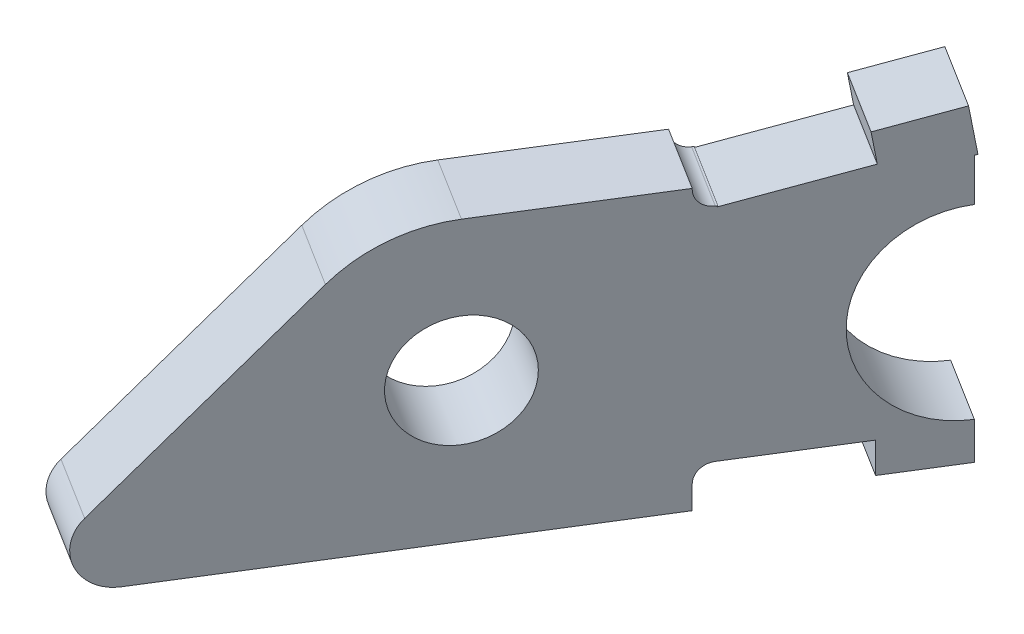
ISO-10303-21;
HEADER;
FILE_DESCRIPTION(('STEP AP214'),'2;1');
FILE_NAME('part.step','',(''),(''),'','','');
FILE_SCHEMA(('AUTOMOTIVE_DESIGN { 1 0 10303 214 1 1 1 1 }'));
ENDSEC;
DATA;
#1=APPLICATION_CONTEXT('core data for automotive mechanical design processes');
#2=APPLICATION_PROTOCOL_DEFINITION('international standard','automotive_design',2000,#1);
#3=PRODUCT_CONTEXT('',#1,'mechanical');
#4=PRODUCT('Part','Part','',(#3));
#5=PRODUCT_RELATED_PRODUCT_CATEGORY('part','',(#4));
#6=PRODUCT_DEFINITION_FORMATION('','',#4);
#7=PRODUCT_DEFINITION_CONTEXT('part definition',#1,'design');
#8=PRODUCT_DEFINITION('design','',#6,#7);
#9=PRODUCT_DEFINITION_SHAPE('','',#8);
#10=(LENGTH_UNIT() NAMED_UNIT(*) SI_UNIT(.MILLI.,.METRE.));
#11=(NAMED_UNIT(*) PLANE_ANGLE_UNIT() SI_UNIT($,.RADIAN.));
#12=(NAMED_UNIT(*) SI_UNIT($,.STERADIAN.) SOLID_ANGLE_UNIT());
#13=UNCERTAINTY_MEASURE_WITH_UNIT(LENGTH_MEASURE(1.E-05),#10,'distance_accuracy_value','');
#14=(GEOMETRIC_REPRESENTATION_CONTEXT(3) GLOBAL_UNCERTAINTY_ASSIGNED_CONTEXT((#13)) GLOBAL_UNIT_ASSIGNED_CONTEXT((#10,
#11,#12)) REPRESENTATION_CONTEXT('',''));
#15=CARTESIAN_POINT('',(0.,0.,0.));
#16=DIRECTION('',(0.,0.,1.));
#17=DIRECTION('',(1.,0.,0.));
#18=AXIS2_PLACEMENT_3D('',#15,#16,#17);
#19=CARTESIAN_POINT('',(-303.516187291777,18.3897329746042,199.478474923757));
#20=DIRECTION('',(0.523412538698552,0.156226295448654,-0.837635158612344));
#21=DIRECTION('',(-0.0827873235380288,0.987721288932455,0.132487412424803));
#22=AXIS2_PLACEMENT_3D('',#19,#20,#21);
#23=PLANE('',#22);
#24=DIRECTION('',(0.84804809615643,0.,0.529919264233198));
#25=VECTOR('',#24,1.);
#26=CARTESIAN_POINT('',(-304.318604910329,27.9632392867643,200.762611545437));
#27=LINE('',#26,#25);
#28=CARTESIAN_POINT('',(-311.102989679581,27.9632392867643,196.523257431571));
#29=VERTEX_POINT('',#28);
#30=CARTESIAN_POINT('',(-304.318604910329,27.9632392867643,200.762611545437));
#31=VERTEX_POINT('',#30);
#32=EDGE_CURVE('E11',#29,#31,#27,.T.);
#33=ORIENTED_EDGE('',*,*,#32,.F.);
#34=DIRECTION('',(-0.0827873235380288,0.987721288932455,0.132487412424803));
#35=VECTOR('',#34,1.);
#36=CARTESIAN_POINT('',(-310.300572061029,18.3897329746042,195.239120809892));
#37=LINE('',#36,#35);
#38=CARTESIAN_POINT('',(-311.109937403664,28.0461313853814,196.53437611432));
#39=VERTEX_POINT('',#38);
#40=EDGE_CURVE('E151',#29,#39,#37,.T.);
#41=ORIENTED_EDGE('',*,*,#40,.T.);
#42=DIRECTION('',(0.84804809615643,0.,0.529919264233198));
#43=VECTOR('',#42,1.);
#44=CARTESIAN_POINT('',(-304.325552634413,28.0461313853814,200.773730228186));
#45=LINE('',#44,#43);
#46=CARTESIAN_POINT('',(-304.325552634413,28.0461313853814,200.773730228186));
#47=VERTEX_POINT('',#46);
#48=EDGE_CURVE('E47',#39,#47,#45,.T.);
#49=ORIENTED_EDGE('',*,*,#48,.T.);
#50=DIRECTION('',(-0.0827873235380288,0.987721288932455,0.132487412424803));
#51=VECTOR('',#50,1.);
#52=CARTESIAN_POINT('',(-303.516187291777,18.3897329746042,199.478474923757));
#53=LINE('',#52,#51);
#54=EDGE_CURVE('E282',#31,#47,#53,.T.);
#55=ORIENTED_EDGE('',*,*,#54,.F.);
#56=EDGE_LOOP('',(#33,#41,#49,#55));
#57=FACE_BOUND('',#56,.T.);
#58=ADVANCED_FACE('F37',(#57),#23,.T.);
#59=CARTESIAN_POINT('',(-315.89166482783,20.7531190864135,219.283378938074));
#60=DIRECTION('',(-0.167940304286642,0.948453350279936,0.26876066776758));
#61=DIRECTION('',(-0.502603701539855,-0.316916775104704,0.804334057998087));
#62=AXIS2_PLACEMENT_3D('',#59,#60,#61);
#63=PLANE('',#62);
#64=ORIENTED_EDGE('',*,*,#48,.F.);
#65=DIRECTION('',(-0.502603701539855,-0.316916775104704,0.804334057998087));
#66=VECTOR('',#65,1.);
#67=CARTESIAN_POINT('',(-322.676049597081,20.7531190864135,215.044024824208));
#68=LINE('',#67,#66);
#69=CARTESIAN_POINT('',(-311.058973651794,28.0782665803526,196.452817062474));
#70=VERTEX_POINT('',#69);
#71=EDGE_CURVE('E215',#70,#39,#68,.T.);
#72=ORIENTED_EDGE('',*,*,#71,.F.);
#73=DIRECTION('',(0.84804809615643,0.,0.529919264233198));
#74=VECTOR('',#73,1.);
#75=CARTESIAN_POINT('',(-304.274588882551,28.0782665803526,200.692171176334));
#76=LINE('',#75,#74);
#77=CARTESIAN_POINT('',(-304.274588882551,28.0782665803526,200.692171176334));
#78=VERTEX_POINT('',#77);
#79=EDGE_CURVE('E275',#70,#78,#76,.T.);
#80=ORIENTED_EDGE('',*,*,#79,.T.);
#81=DIRECTION('',(-0.502603701539855,-0.316916775104704,0.804334057998087));
#82=VECTOR('',#81,1.);
#83=CARTESIAN_POINT('',(-315.89166482783,20.7531190864135,219.283378938074));
#84=LINE('',#83,#82);
#85=EDGE_CURVE('E293',#78,#47,#84,.T.);
#86=ORIENTED_EDGE('',*,*,#85,.T.);
#87=EDGE_LOOP('',(#64,#72,#80,#86));
#88=FACE_BOUND('',#87,.T.);
#89=ADVANCED_FACE('F296',(#88),#63,.F.);
#90=CARTESIAN_POINT('',(-314.872974167204,28.0782665803526,217.653133099463));
#91=DIRECTION('',(0.,1.,0.));
#92=DIRECTION('',(-0.529919264233198,0.,0.84804809615643));
#93=AXIS2_PLACEMENT_3D('',#90,#91,#92);
#94=PLANE('',#93);
#95=ORIENTED_EDGE('',*,*,#79,.F.);
#96=DIRECTION('',(0.529919264233198,0.,-0.84804809615643));
#97=VECTOR('',#96,1.);
#98=CARTESIAN_POINT('',(-321.657358936455,28.0782665803526,213.413778985597));
#99=LINE('',#98,#97);
#100=CARTESIAN_POINT('',(-311.164957504638,28.0782665803526,196.6224266817));
#101=VERTEX_POINT('',#100);
#102=EDGE_CURVE('E212',#70,#101,#99,.F.);
#103=ORIENTED_EDGE('',*,*,#102,.T.);
#104=DIRECTION('',(0.84804809615643,0.,0.529919264233198));
#105=VECTOR('',#104,1.);
#106=CARTESIAN_POINT('',(-304.380572735386,28.0782665803526,200.861780795565));
#107=LINE('',#106,#105);
#108=CARTESIAN_POINT('',(-304.380572735386,28.0782665803526,200.861780795565));
#109=VERTEX_POINT('',#108);
#110=EDGE_CURVE('E272',#101,#109,#107,.T.);
#111=ORIENTED_EDGE('',*,*,#110,.T.);
#112=DIRECTION('',(-0.529919264233198,0.,0.84804809615643));
#113=VECTOR('',#112,1.);
#114=CARTESIAN_POINT('',(-314.872974167204,28.0782665803526,217.653133099463));
#115=LINE('',#114,#113);
#116=EDGE_CURVE('E297',#78,#109,#115,.T.);
#117=ORIENTED_EDGE('',*,*,#116,.F.);
#118=EDGE_LOOP('',(#95,#103,#111,#117));
#119=FACE_BOUND('',#118,.T.);
#120=ADVANCED_FACE('F370',(#119),#94,.T.);
#121=CARTESIAN_POINT('',(-304.380572735386,29.8782665803526,200.861780795565));
#122=DIRECTION('',(0.84804809615643,0.,0.529919264233198));
#123=DIRECTION('',(0.529919264233198,0.,-0.84804809615643));
#124=AXIS2_PLACEMENT_3D('',#121,#122,#123);
#125=CYLINDRICAL_SURFACE('',#124,1.80000000000004);
#126=ORIENTED_EDGE('',*,*,#110,.F.);
#127=CARTESIAN_POINT('',(-311.164957504638,29.8782665803526,196.6224266817));
#128=DIRECTION('',(0.84804809615643,0.,0.529919264233198));
#129=DIRECTION('',(0.529919264233198,0.,-0.84804809615643));
#130=AXIS2_PLACEMENT_3D('',#127,#128,#129);
#131=CIRCLE('',#130,1.80000000000004);
#132=CARTESIAN_POINT('',(-312.118812180258,29.8782665803526,198.148913254781));
#133=VERTEX_POINT('',#132);
#134=EDGE_CURVE('E209',#101,#133,#131,.F.);
#135=ORIENTED_EDGE('',*,*,#134,.T.);
#136=DIRECTION('',(0.84804809615643,0.,0.529919264233198));
#137=VECTOR('',#136,1.);
#138=CARTESIAN_POINT('',(-305.334427411006,29.8782665803526,202.388267368647));
#139=LINE('',#138,#137);
#140=CARTESIAN_POINT('',(-305.334427411006,29.8782665803526,202.388267368647));
#141=VERTEX_POINT('',#140);
#142=EDGE_CURVE('E269',#133,#141,#139,.T.);
#143=ORIENTED_EDGE('',*,*,#142,.T.);
#144=CARTESIAN_POINT('',(-304.380572735386,29.8782665803526,200.861780795565));
#145=DIRECTION('',(0.84804809615643,0.,0.529919264233198));
#146=DIRECTION('',(0.529919264233198,0.,-0.84804809615643));
#147=AXIS2_PLACEMENT_3D('',#144,#145,#146);
#148=CIRCLE('',#147,1.80000000000004);
#149=EDGE_CURVE('E299',#109,#141,#148,.F.);
#150=ORIENTED_EDGE('',*,*,#149,.F.);
#151=EDGE_LOOP('',(#126,#135,#143,#150));
#152=FACE_BOUND('',#151,.T.);
#153=ADVANCED_FACE('F447',(#152),#125,.F.);
#154=CARTESIAN_POINT('',(-305.334427411006,14.9999999999993,202.388267368647));
#155=DIRECTION('',(0.529919264233198,0.,-0.84804809615643));
#156=DIRECTION('',(0.,1.,0.));
#157=AXIS2_PLACEMENT_3D('',#154,#155,#156);
#158=PLANE('',#157);
#159=ORIENTED_EDGE('',*,*,#142,.F.);
#160=DIRECTION('',(0.,1.,0.));
#161=VECTOR('',#160,1.);
#162=CARTESIAN_POINT('',(-312.118812180258,15.,198.148913254781));
#163=LINE('',#162,#161);
#164=CARTESIAN_POINT('',(-312.118812180258,30.,198.148913254781));
#165=VERTEX_POINT('',#164);
#166=EDGE_CURVE('E206',#133,#165,#163,.T.);
#167=ORIENTED_EDGE('',*,*,#166,.T.);
#168=DIRECTION('',(0.84804809615643,0.,0.529919264233198));
#169=VECTOR('',#168,1.);
#170=CARTESIAN_POINT('',(-305.334427411006,30.,202.388267368647));
#171=LINE('',#170,#169);
#172=CARTESIAN_POINT('',(-305.334427411006,30.,202.388267368647));
#173=VERTEX_POINT('',#172);
#174=EDGE_CURVE('E266',#165,#173,#171,.T.);
#175=ORIENTED_EDGE('',*,*,#174,.T.);
#176=DIRECTION('',(0.,1.,0.));
#177=VECTOR('',#176,1.);
#178=CARTESIAN_POINT('',(-305.334427411006,14.9999999999993,202.388267368647));
#179=LINE('',#178,#177);
#180=EDGE_CURVE('E305',#141,#173,#179,.T.);
#181=ORIENTED_EDGE('',*,*,#180,.F.);
#182=EDGE_LOOP('',(#159,#167,#175,#181));
#183=FACE_BOUND('',#182,.T.);
#184=ADVANCED_FACE('F443',(#183),#158,.T.);
#185=CARTESIAN_POINT('',(-314.872974167204,30.,217.653133099463));
#186=DIRECTION('',(0.,1.,0.));
#187=DIRECTION('',(-0.529919264233199,0.,0.84804809615643));
#188=AXIS2_PLACEMENT_3D('',#185,#186,#187);
#189=PLANE('',#188);
#190=ORIENTED_EDGE('',*,*,#174,.F.);
#191=DIRECTION('',(0.529919264233198,0.,-0.84804809615643));
#192=VECTOR('',#191,1.);
#193=CARTESIAN_POINT('',(-321.657358936455,30.,213.413778985597));
#194=LINE('',#193,#192);
#195=CARTESIAN_POINT('',(-321.657358936455,30.,213.413778985597));
#196=VERTEX_POINT('',#195);
#197=EDGE_CURVE('E203',#165,#196,#194,.F.);
#198=ORIENTED_EDGE('',*,*,#197,.T.);
#199=DIRECTION('',(0.84804809615643,0.,0.529919264233198));
#200=VECTOR('',#199,1.);
#201=CARTESIAN_POINT('',(-314.872974167204,30.,217.653133099463));
#202=LINE('',#201,#200);
#203=CARTESIAN_POINT('',(-314.872974167204,30.,217.653133099463));
#204=VERTEX_POINT('',#203);
#205=EDGE_CURVE('E263',#196,#204,#202,.T.);
#206=ORIENTED_EDGE('',*,*,#205,.T.);
#207=DIRECTION('',(-0.529919264233199,0.,0.84804809615643));
#208=VECTOR('',#207,1.);
#209=CARTESIAN_POINT('',(-314.872974167204,30.,217.653133099463));
#210=LINE('',#209,#208);
#211=EDGE_CURVE('E308',#173,#204,#210,.T.);
#212=ORIENTED_EDGE('',*,*,#211,.F.);
#213=EDGE_LOOP('',(#190,#198,#206,#212));
#214=FACE_BOUND('',#213,.T.);
#215=ADVANCED_FACE('F439',(#214),#189,.T.);
#216=CARTESIAN_POINT('',(-314.872974167204,15.,217.653133099463));
#217=DIRECTION('',(0.84804809615643,0.,0.529919264233198));
#218=DIRECTION('',(0.529919264233198,0.,-0.84804809615643));
#219=AXIS2_PLACEMENT_3D('',#216,#217,#218);
#220=CYLINDRICAL_SURFACE('',#219,15.);
#221=ORIENTED_EDGE('',*,*,#205,.F.);
#222=CARTESIAN_POINT('',(-321.657358936455,15.,213.413778985597));
#223=DIRECTION('',(0.84804809615643,0.,0.529919264233198));
#224=DIRECTION('',(0.529919264233198,0.,-0.84804809615643));
#225=AXIS2_PLACEMENT_3D('',#222,#223,#224);
#226=CIRCLE('',#225,15.);
#227=CARTESIAN_POINT('',(-327.278001514765,25.6066017177983,222.408687379065));
#228=VERTEX_POINT('',#227);
#229=EDGE_CURVE('E200',#196,#228,#226,.T.);
#230=ORIENTED_EDGE('',*,*,#229,.T.);
#231=DIRECTION('',(0.84804809615643,0.,0.529919264233198));
#232=VECTOR('',#231,1.);
#233=CARTESIAN_POINT('',(-320.493616745514,25.6066017177983,226.648041492931));
#234=LINE('',#233,#232);
#235=CARTESIAN_POINT('',(-320.493616745514,25.6066017177983,226.648041492931));
#236=VERTEX_POINT('',#235);
#237=EDGE_CURVE('E260',#228,#236,#234,.T.);
#238=ORIENTED_EDGE('',*,*,#237,.T.);
#239=CARTESIAN_POINT('',(-314.872974167204,15.,217.653133099463));
#240=DIRECTION('',(0.84804809615643,0.,0.529919264233198));
#241=DIRECTION('',(0.529919264233198,0.,-0.84804809615643));
#242=AXIS2_PLACEMENT_3D('',#239,#240,#241);
#243=CIRCLE('',#242,15.);
#244=EDGE_CURVE('E311',#204,#236,#243,.T.);
#245=ORIENTED_EDGE('',*,*,#244,.F.);
#246=EDGE_LOOP('',(#221,#230,#238,#245));
#247=FACE_BOUND('',#246,.T.);
#248=ADVANCED_FACE('F435',(#247),#220,.T.);
#249=CARTESIAN_POINT('',(-320.493616745514,25.6066017177983,226.648041492931));
#250=DIRECTION('',(-0.374709505220678,0.707106781186551,0.59966055956455));
#251=DIRECTION('',(-0.374709505220682,-0.707106781186544,0.599660559564557));
#252=AXIS2_PLACEMENT_3D('',#249,#250,#251);
#253=PLANE('',#252);
#254=ORIENTED_EDGE('',*,*,#237,.F.);
#255=DIRECTION('',(-0.374709505220682,-0.707106781186544,0.599660559564557));
#256=VECTOR('',#255,1.);
#257=CARTESIAN_POINT('',(-327.278001514765,25.6066017177983,222.408687379065));
#258=LINE('',#257,#256);
#259=CARTESIAN_POINT('',(-337.228917978758,6.8284271247462,238.333482591996));
#260=VERTEX_POINT('',#259);
#261=EDGE_CURVE('E197',#228,#260,#258,.T.);
#262=ORIENTED_EDGE('',*,*,#261,.T.);
#263=DIRECTION('',(0.84804809615643,0.,0.529919264233198));
#264=VECTOR('',#263,1.);
#265=CARTESIAN_POINT('',(-330.444533209507,6.82842712474621,242.572836705862));
#266=LINE('',#265,#264);
#267=CARTESIAN_POINT('',(-330.444533209507,6.82842712474621,242.572836705862));
#268=VERTEX_POINT('',#267);
#269=EDGE_CURVE('E257',#260,#268,#266,.T.);
#270=ORIENTED_EDGE('',*,*,#269,.T.);
#271=DIRECTION('',(-0.374709505220682,-0.707106781186544,0.599660559564557));
#272=VECTOR('',#271,1.);
#273=CARTESIAN_POINT('',(-320.493616745514,25.6066017177983,226.648041492931));
#274=LINE('',#273,#272);
#275=EDGE_CURVE('E314',#236,#268,#274,.T.);
#276=ORIENTED_EDGE('',*,*,#275,.F.);
#277=EDGE_LOOP('',(#254,#262,#270,#276));
#278=FACE_BOUND('',#277,.T.);
#279=ADVANCED_FACE('F431',(#278),#253,.T.);
#280=CARTESIAN_POINT('',(-328.945695188624,4.,240.174194467604));
#281=DIRECTION('',(0.84804809615643,0.,0.529919264233198));
#282=DIRECTION('',(0.529919264233198,0.,-0.84804809615643));
#283=AXIS2_PLACEMENT_3D('',#280,#281,#282);
#284=CYLINDRICAL_SURFACE('',#283,4.);
#285=ORIENTED_EDGE('',*,*,#269,.F.);
#286=CARTESIAN_POINT('',(-335.730079957875,4.,235.934840353738));
#287=DIRECTION('',(0.84804809615643,0.,0.529919264233198));
#288=DIRECTION('',(0.529919264233198,0.,-0.84804809615643));
#289=AXIS2_PLACEMENT_3D('',#286,#287,#288);
#290=CIRCLE('',#289,4.);
#291=CARTESIAN_POINT('',(-335.730079957875,0.,235.934840353738));
#292=VERTEX_POINT('',#291);
#293=EDGE_CURVE('E194',#260,#292,#290,.T.);
#294=ORIENTED_EDGE('',*,*,#293,.T.);
#295=DIRECTION('',(0.84804809615643,0.,0.529919264233198));
#296=VECTOR('',#295,1.);
#297=CARTESIAN_POINT('',(-328.945695188624,0.,240.174194467604));
#298=LINE('',#297,#296);
#299=CARTESIAN_POINT('',(-328.945695188624,0.,240.174194467604));
#300=VERTEX_POINT('',#299);
#301=EDGE_CURVE('E254',#292,#300,#298,.T.);
#302=ORIENTED_EDGE('',*,*,#301,.T.);
#303=CARTESIAN_POINT('',(-328.945695188624,4.,240.174194467604));
#304=DIRECTION('',(0.84804809615643,0.,0.529919264233198));
#305=DIRECTION('',(0.529919264233198,0.,-0.84804809615643));
#306=AXIS2_PLACEMENT_3D('',#303,#304,#305);
#307=CIRCLE('',#306,4.);
#308=EDGE_CURVE('E317',#268,#300,#307,.T.);
#309=ORIENTED_EDGE('',*,*,#308,.F.);
#310=EDGE_LOOP('',(#285,#294,#302,#309));
#311=FACE_BOUND('',#310,.T.);
#312=ADVANCED_FACE('F427',(#311),#284,.T.);
#313=CARTESIAN_POINT('',(-314.872974167204,0.,217.653133099463));
#314=DIRECTION('',(0.,-1.,0.));
#315=DIRECTION('',(0.529919264233199,0.,-0.84804809615643));
#316=AXIS2_PLACEMENT_3D('',#313,#314,#315);
#317=PLANE('',#316);
#318=ORIENTED_EDGE('',*,*,#301,.F.);
#319=DIRECTION('',(0.529919264233198,0.,-0.84804809615643));
#320=VECTOR('',#319,1.);
#321=CARTESIAN_POINT('',(-321.657358936455,0.,213.413778985597));
#322=LINE('',#321,#320);
#323=CARTESIAN_POINT('',(-312.118812180258,0.,198.148913254781));
#324=VERTEX_POINT('',#323);
#325=EDGE_CURVE('E191',#292,#324,#322,.T.);
#326=ORIENTED_EDGE('',*,*,#325,.T.);
#327=DIRECTION('',(0.84804809615643,0.,0.529919264233198));
#328=VECTOR('',#327,1.);
#329=CARTESIAN_POINT('',(-305.334427411006,0.,202.388267368647));
#330=LINE('',#329,#328);
#331=CARTESIAN_POINT('',(-305.334427411006,0.,202.388267368647));
#332=VERTEX_POINT('',#331);
#333=EDGE_CURVE('E251',#324,#332,#330,.T.);
#334=ORIENTED_EDGE('',*,*,#333,.T.);
#335=DIRECTION('',(0.529919264233199,0.,-0.84804809615643));
#336=VECTOR('',#335,1.);
#337=CARTESIAN_POINT('',(-314.872974167204,0.,217.653133099463));
#338=LINE('',#337,#336);
#339=EDGE_CURVE('E320',#300,#332,#338,.T.);
#340=ORIENTED_EDGE('',*,*,#339,.F.);
#341=EDGE_LOOP('',(#318,#326,#334,#340));
#342=FACE_BOUND('',#341,.T.);
#343=ADVANCED_FACE('F423',(#342),#317,.T.);
#344=CARTESIAN_POINT('',(-305.334427411006,15.,202.388267368647));
#345=DIRECTION('',(0.529919264233198,0.,-0.84804809615643));
#346=DIRECTION('',(0.,1.,0.));
#347=AXIS2_PLACEMENT_3D('',#344,#345,#346);
#348=PLANE('',#347);
#349=ORIENTED_EDGE('',*,*,#333,.F.);
#350=DIRECTION('',(0.,1.,0.));
#351=VECTOR('',#350,1.);
#352=CARTESIAN_POINT('',(-312.118812180258,15.,198.148913254781));
#353=LINE('',#352,#351);
#354=CARTESIAN_POINT('',(-312.118812180258,2.5,198.148913254781));
#355=VERTEX_POINT('',#354);
#356=EDGE_CURVE('E188',#324,#355,#353,.T.);
#357=ORIENTED_EDGE('',*,*,#356,.T.);
#358=DIRECTION('',(0.84804809615643,0.,0.529919264233198));
#359=VECTOR('',#358,1.);
#360=CARTESIAN_POINT('',(-305.334427411006,2.50000000000001,202.388267368647));
#361=LINE('',#360,#359);
#362=CARTESIAN_POINT('',(-305.334427411006,2.50000000000001,202.388267368647));
#363=VERTEX_POINT('',#362);
#364=EDGE_CURVE('E248',#355,#363,#361,.T.);
#365=ORIENTED_EDGE('',*,*,#364,.T.);
#366=DIRECTION('',(0.,1.,0.));
#367=VECTOR('',#366,1.);
#368=CARTESIAN_POINT('',(-305.334427411006,15.,202.388267368647));
#369=LINE('',#368,#367);
#370=EDGE_CURVE('E323',#332,#363,#369,.T.);
#371=ORIENTED_EDGE('',*,*,#370,.F.);
#372=EDGE_LOOP('',(#349,#357,#365,#371));
#373=FACE_BOUND('',#372,.T.);
#374=ADVANCED_FACE('F419',(#373),#348,.T.);
#375=CARTESIAN_POINT('',(-304.380572735386,2.50000000000001,200.861780795565));
#376=DIRECTION('',(0.84804809615643,0.,0.529919264233198));
#377=DIRECTION('',(0.529919264233198,0.,-0.84804809615643));
#378=AXIS2_PLACEMENT_3D('',#375,#376,#377);
#379=CYLINDRICAL_SURFACE('',#378,1.79999999999999);
#380=ORIENTED_EDGE('',*,*,#364,.F.);
#381=CARTESIAN_POINT('',(-311.164957504638,2.50000000000001,196.6224266817));
#382=DIRECTION('',(0.84804809615643,0.,0.529919264233198));
#383=DIRECTION('',(0.529919264233198,0.,-0.84804809615643));
#384=AXIS2_PLACEMENT_3D('',#381,#382,#383);
#385=CIRCLE('',#384,1.79999999999999);
#386=CARTESIAN_POINT('',(-311.164957504638,4.3,196.6224266817));
#387=VERTEX_POINT('',#386);
#388=EDGE_CURVE('E185',#355,#387,#385,.F.);
#389=ORIENTED_EDGE('',*,*,#388,.T.);
#390=DIRECTION('',(0.84804809615643,0.,0.529919264233198));
#391=VECTOR('',#390,1.);
#392=CARTESIAN_POINT('',(-304.380572735386,4.30000000000001,200.861780795565));
#393=LINE('',#392,#391);
#394=CARTESIAN_POINT('',(-304.380572735386,4.30000000000001,200.861780795565));
#395=VERTEX_POINT('',#394);
#396=EDGE_CURVE('E245',#387,#395,#393,.T.);
#397=ORIENTED_EDGE('',*,*,#396,.T.);
#398=CARTESIAN_POINT('',(-304.380572735386,2.50000000000001,200.861780795565));
#399=DIRECTION('',(0.84804809615643,0.,0.529919264233198));
#400=DIRECTION('',(0.529919264233198,0.,-0.84804809615643));
#401=AXIS2_PLACEMENT_3D('',#398,#399,#400);
#402=CIRCLE('',#401,1.79999999999999);
#403=EDGE_CURVE('E326',#363,#395,#402,.F.);
#404=ORIENTED_EDGE('',*,*,#403,.F.);
#405=EDGE_LOOP('',(#380,#389,#397,#404));
#406=FACE_BOUND('',#405,.T.);
#407=ADVANCED_FACE('F415',(#406),#379,.F.);
#408=CARTESIAN_POINT('',(-314.872974167204,4.30000000000018,217.653133099463));
#409=DIRECTION('',(0.,-1.,0.));
#410=DIRECTION('',(0.529919264233198,0.,-0.84804809615643));
#411=AXIS2_PLACEMENT_3D('',#408,#409,#410);
#412=PLANE('',#411);
#413=ORIENTED_EDGE('',*,*,#396,.F.);
#414=DIRECTION('',(0.529919264233198,0.,-0.84804809615643));
#415=VECTOR('',#414,1.);
#416=CARTESIAN_POINT('',(-321.657358936455,4.3,213.413778985597));
#417=LINE('',#416,#415);
#418=CARTESIAN_POINT('',(-304.540966701723,4.3,186.021825479744));
#419=VERTEX_POINT('',#418);
#420=EDGE_CURVE('E182',#387,#419,#417,.T.);
#421=ORIENTED_EDGE('',*,*,#420,.T.);
#422=DIRECTION('',(0.84804809615643,0.,0.529919264233198));
#423=VECTOR('',#422,1.);
#424=CARTESIAN_POINT('',(-297.756581932471,4.3,190.26117959361));
#425=LINE('',#424,#423);
#426=CARTESIAN_POINT('',(-297.756581932471,4.3,190.26117959361));
#427=VERTEX_POINT('',#426);
#428=EDGE_CURVE('E242',#419,#427,#425,.T.);
#429=ORIENTED_EDGE('',*,*,#428,.T.);
#430=DIRECTION('',(0.529919264233198,0.,-0.84804809615643));
#431=VECTOR('',#430,1.);
#432=CARTESIAN_POINT('',(-314.872974167204,4.30000000000018,217.653133099463));
#433=LINE('',#432,#431);
#434=EDGE_CURVE('E329',#395,#427,#433,.T.);
#435=ORIENTED_EDGE('',*,*,#434,.F.);
#436=EDGE_LOOP('',(#413,#421,#429,#435));
#437=FACE_BOUND('',#436,.T.);
#438=ADVANCED_FACE('F411',(#437),#412,.T.);
#439=CARTESIAN_POINT('',(-297.756581932471,4.3,190.26117959361));
#440=DIRECTION('',(-0.529919264233198,0.,0.848048096156431));
#441=DIRECTION('',(0.,-1.,0.));
#442=AXIS2_PLACEMENT_3D('',#439,#440,#441);
#443=PLANE('',#442);
#444=ORIENTED_EDGE('',*,*,#428,.F.);
#445=DIRECTION('',(0.,1.,0.));
#446=VECTOR('',#445,1.);
#447=CARTESIAN_POINT('',(-304.540966701723,15.,186.021825479744));
#448=LINE('',#447,#446);
#449=CARTESIAN_POINT('',(-304.540966701723,0.999999999999994,186.021825479744));
#450=VERTEX_POINT('',#449);
#451=EDGE_CURVE('E179',#419,#450,#448,.F.);
#452=ORIENTED_EDGE('',*,*,#451,.T.);
#453=DIRECTION('',(0.84804809615643,0.,0.529919264233198));
#454=VECTOR('',#453,1.);
#455=CARTESIAN_POINT('',(-297.756581932471,1.,190.26117959361));
#456=LINE('',#455,#454);
#457=CARTESIAN_POINT('',(-297.756581932471,1.,190.26117959361));
#458=VERTEX_POINT('',#457);
#459=EDGE_CURVE('E239',#450,#458,#456,.T.);
#460=ORIENTED_EDGE('',*,*,#459,.T.);
#461=DIRECTION('',(0.,-1.,0.));
#462=VECTOR('',#461,1.);
#463=CARTESIAN_POINT('',(-297.756581932471,4.3,190.26117959361));
#464=LINE('',#463,#462);
#465=EDGE_CURVE('E332',#427,#458,#464,.T.);
#466=ORIENTED_EDGE('',*,*,#465,.F.);
#467=EDGE_LOOP('',(#444,#452,#460,#466));
#468=FACE_BOUND('',#467,.T.);
#469=ADVANCED_FACE('F407',(#468),#443,.T.);
#470=CARTESIAN_POINT('',(-314.872974167204,1.,217.653133099463));
#471=DIRECTION('',(0.,-1.,0.));
#472=DIRECTION('',(0.529919264233198,0.,-0.84804809615643));
#473=AXIS2_PLACEMENT_3D('',#470,#471,#472);
#474=PLANE('',#473);
#475=ORIENTED_EDGE('',*,*,#459,.F.);
#476=DIRECTION('',(0.529919264233198,0.,-0.84804809615643));
#477=VECTOR('',#476,1.);
#478=CARTESIAN_POINT('',(-321.657358936455,0.999999999999994,213.413778985597));
#479=LINE('',#478,#477);
#480=CARTESIAN_POINT('',(-300.460588367127,0.999999999999994,179.49185513934));
#481=VERTEX_POINT('',#480);
#482=EDGE_CURVE('E176',#450,#481,#479,.T.);
#483=ORIENTED_EDGE('',*,*,#482,.T.);
#484=DIRECTION('',(0.84804809615643,0.,0.529919264233198));
#485=VECTOR('',#484,1.);
#486=CARTESIAN_POINT('',(-293.676203597876,1.,183.731209253205));
#487=LINE('',#486,#485);
#488=CARTESIAN_POINT('',(-293.676203597876,1.,183.731209253205));
#489=VERTEX_POINT('',#488);
#490=EDGE_CURVE('E236',#481,#489,#487,.T.);
#491=ORIENTED_EDGE('',*,*,#490,.T.);
#492=DIRECTION('',(0.529919264233198,0.,-0.84804809615643));
#493=VECTOR('',#492,1.);
#494=CARTESIAN_POINT('',(-314.872974167204,1.,217.653133099463));
#495=LINE('',#494,#493);
#496=EDGE_CURVE('E335',#458,#489,#495,.T.);
#497=ORIENTED_EDGE('',*,*,#496,.F.);
#498=EDGE_LOOP('',(#475,#483,#491,#497));
#499=FACE_BOUND('',#498,.T.);
#500=ADVANCED_FACE('F403',(#499),#474,.T.);
#501=CARTESIAN_POINT('',(-293.676203597876,0.,183.731209253205));
#502=DIRECTION('',(0.529919264233198,0.,-0.84804809615643));
#503=DIRECTION('',(0.,1.,0.));
#504=AXIS2_PLACEMENT_3D('',#501,#502,#503);
#505=PLANE('',#504);
#506=ORIENTED_EDGE('',*,*,#490,.F.);
#507=DIRECTION('',(0.,1.,0.));
#508=VECTOR('',#507,1.);
#509=CARTESIAN_POINT('',(-300.460588367127,15.,179.49185513934));
#510=LINE('',#509,#508);
#511=CARTESIAN_POINT('',(-300.460588367127,4.99999999999999,179.49185513934));
#512=VERTEX_POINT('',#511);
#513=EDGE_CURVE('E173',#481,#512,#510,.T.);
#514=ORIENTED_EDGE('',*,*,#513,.T.);
#515=DIRECTION('',(0.84804809615643,0.,0.529919264233198));
#516=VECTOR('',#515,1.);
#517=CARTESIAN_POINT('',(-293.676203597876,5.,183.731209253205));
#518=LINE('',#517,#516);
#519=CARTESIAN_POINT('',(-293.676203597876,5.,183.731209253205));
#520=VERTEX_POINT('',#519);
#521=EDGE_CURVE('E233',#512,#520,#518,.T.);
#522=ORIENTED_EDGE('',*,*,#521,.T.);
#523=DIRECTION('',(0.,1.,0.));
#524=VECTOR('',#523,1.);
#525=CARTESIAN_POINT('',(-293.676203597876,0.,183.731209253205));
#526=LINE('',#525,#524);
#527=EDGE_CURVE('E338',#489,#520,#526,.T.);
#528=ORIENTED_EDGE('',*,*,#527,.F.);
#529=EDGE_LOOP('',(#506,#514,#522,#528));
#530=FACE_BOUND('',#529,.T.);
#531=ADVANCED_FACE('F399',(#530),#505,.T.);
#532=CARTESIAN_POINT('',(-293.676203597876,15.,183.731209253205));
#533=DIRECTION('',(-0.84804809615643,0.,-0.529919264233198));
#534=DIRECTION('',(-0.529919264233198,0.,0.84804809615643));
#535=AXIS2_PLACEMENT_3D('',#532,#533,#534);
#536=CYLINDRICAL_SURFACE('',#535,10.);
#537=ORIENTED_EDGE('',*,*,#521,.F.);
#538=CARTESIAN_POINT('',(-300.460588367127,15.,179.49185513934));
#539=DIRECTION('',(-0.84804809615643,0.,-0.529919264233198));
#540=DIRECTION('',(-0.529919264233198,0.,0.84804809615643));
#541=AXIS2_PLACEMENT_3D('',#538,#539,#540);
#542=CIRCLE('',#541,10.);
#543=CARTESIAN_POINT('',(-300.460588367127,25.,179.49185513934));
#544=VERTEX_POINT('',#543);
#545=EDGE_CURVE('E170',#512,#544,#542,.T.);
#546=ORIENTED_EDGE('',*,*,#545,.T.);
#547=DIRECTION('',(0.84804809615643,0.,0.529919264233198));
#548=VECTOR('',#547,1.);
#549=CARTESIAN_POINT('',(-293.676203597876,25.,183.731209253205));
#550=LINE('',#549,#548);
#551=CARTESIAN_POINT('',(-293.676203597876,25.,183.731209253205));
#552=VERTEX_POINT('',#551);
#553=EDGE_CURVE('E230',#544,#552,#550,.T.);
#554=ORIENTED_EDGE('',*,*,#553,.T.);
#555=CARTESIAN_POINT('',(-293.676203597876,15.,183.731209253205));
#556=DIRECTION('',(-0.84804809615643,0.,-0.529919264233198));
#557=DIRECTION('',(0.529919264233198,0.,-0.84804809615643));
#558=AXIS2_PLACEMENT_3D('',#555,#556,#557);
#559=CIRCLE('',#558,10.);
#560=EDGE_CURVE('E341',#520,#552,#559,.T.);
#561=ORIENTED_EDGE('',*,*,#560,.F.);
#562=EDGE_LOOP('',(#537,#546,#554,#561));
#563=FACE_BOUND('',#562,.T.);
#564=ADVANCED_FACE('F395',(#563),#536,.F.);
#565=CARTESIAN_POINT('',(-293.676203597876,25.,183.731209253205));
#566=DIRECTION('',(0.529919264233198,0.,-0.84804809615643));
#567=DIRECTION('',(0.,1.,0.));
#568=AXIS2_PLACEMENT_3D('',#565,#566,#567);
#569=PLANE('',#568);
#570=ORIENTED_EDGE('',*,*,#553,.F.);
#571=DIRECTION('',(0.,1.,0.));
#572=VECTOR('',#571,1.);
#573=CARTESIAN_POINT('',(-300.460588367127,15.,179.49185513934));
#574=LINE('',#573,#572);
#575=CARTESIAN_POINT('',(-300.460588367127,29.6017122112906,179.49185513934));
#576=VERTEX_POINT('',#575);
#577=EDGE_CURVE('E167',#544,#576,#574,.T.);
#578=ORIENTED_EDGE('',*,*,#577,.T.);
#579=DIRECTION('',(0.84804809615643,0.,0.529919264233198));
#580=VECTOR('',#579,1.);
#581=CARTESIAN_POINT('',(-293.676203597876,29.6017122112906,183.731209253205));
#582=LINE('',#581,#580);
#583=CARTESIAN_POINT('',(-293.676203597876,29.6017122112906,183.731209253205));
#584=VERTEX_POINT('',#583);
#585=EDGE_CURVE('E227',#576,#584,#582,.T.);
#586=ORIENTED_EDGE('',*,*,#585,.T.);
#587=DIRECTION('',(0.,1.,0.));
#588=VECTOR('',#587,1.);
#589=CARTESIAN_POINT('',(-293.676203597876,25.,183.731209253205));
#590=LINE('',#589,#588);
#591=EDGE_CURVE('E344',#552,#584,#590,.T.);
#592=ORIENTED_EDGE('',*,*,#591,.F.);
#593=EDGE_LOOP('',(#570,#578,#586,#592));
#594=FACE_BOUND('',#593,.T.);
#595=ADVANCED_FACE('F391',(#594),#569,.T.);
#596=CARTESIAN_POINT('',(-134.025350472836,29.6017122112832,-71.7635635936617));
#597=DIRECTION('',(0.,1.,0.));
#598=DIRECTION('',(-0.529919264233198,0.,0.84804809615643));
#599=AXIS2_PLACEMENT_3D('',#596,#597,#598);
#600=PLANE('',#599);
#601=ORIENTED_EDGE('',*,*,#585,.F.);
#602=DIRECTION('',(0.529919264233198,0.,-0.84804809615643));
#603=VECTOR('',#602,1.);
#604=CARTESIAN_POINT('',(-321.657358936455,29.6017122112902,213.413778985597));
#605=LINE('',#604,#603);
#606=CARTESIAN_POINT('',(-300.308509391764,29.6017122112902,179.248477903925));
#607=VERTEX_POINT('',#606);
#608=EDGE_CURVE('E164',#607,#576,#605,.F.);
#609=ORIENTED_EDGE('',*,*,#608,.F.);
#610=DIRECTION('',(0.84804809615643,0.,0.529919264233198));
#611=VECTOR('',#610,1.);
#612=CARTESIAN_POINT('',(-293.524124622513,29.6017122112902,183.487832017791));
#613=LINE('',#612,#611);
#614=CARTESIAN_POINT('',(-293.524124622513,29.6017122112902,183.487832017791));
#615=VERTEX_POINT('',#614);
#616=EDGE_CURVE('E224',#607,#615,#613,.T.);
#617=ORIENTED_EDGE('',*,*,#616,.T.);
#618=DIRECTION('',(-0.529919264233198,0.,0.84804809615643));
#619=VECTOR('',#618,1.);
#620=CARTESIAN_POINT('',(-134.025350472836,29.6017122112832,-71.7635635936617));
#621=LINE('',#620,#619);
#622=EDGE_CURVE('E347',#615,#584,#621,.T.);
#623=ORIENTED_EDGE('',*,*,#622,.T.);
#624=EDGE_LOOP('',(#601,#609,#617,#623));
#625=FACE_BOUND('',#624,.T.);
#626=ADVANCED_FACE('F387',(#625),#600,.F.);
#627=CARTESIAN_POINT('',(-292.413366553618,16.3494491278361,181.710247526728));
#628=DIRECTION('',(-0.523412538698557,-0.156226295448603,0.837635158612351));
#629=DIRECTION('',(0.0827873235380018,-0.987721288932463,-0.13248741242476));
#630=AXIS2_PLACEMENT_3D('',#627,#628,#629);
#631=PLANE('',#630);
#632=ORIENTED_EDGE('',*,*,#616,.F.);
#633=DIRECTION('',(0.0827873235380018,-0.987721288932463,-0.13248741242476));
#634=VECTOR('',#633,1.);
#635=CARTESIAN_POINT('',(-299.19775132287,16.3494491278361,177.470893412862));
#636=LINE('',#635,#634);
#637=CARTESIAN_POINT('',(-300.698465002458,34.2542053945485,179.872537332512));
#638=VERTEX_POINT('',#637);
#639=EDGE_CURVE('E161',#638,#607,#636,.T.);
#640=ORIENTED_EDGE('',*,*,#639,.F.);
#641=DIRECTION('',(0.84804809615643,0.,0.529919264233198));
#642=VECTOR('',#641,1.);
#643=CARTESIAN_POINT('',(-293.914080233206,34.2542053945485,184.111891446377));
#644=LINE('',#643,#642);
#645=CARTESIAN_POINT('',(-293.914080233206,34.2542053945485,184.111891446377));
#646=VERTEX_POINT('',#645);
#647=EDGE_CURVE('E222',#638,#646,#644,.T.);
#648=ORIENTED_EDGE('',*,*,#647,.T.);
#649=DIRECTION('',(0.0827873235380018,-0.987721288932463,-0.13248741242476));
#650=VECTOR('',#649,1.);
#651=CARTESIAN_POINT('',(-292.413366553618,16.3494491278361,181.710247526728));
#652=LINE('',#651,#650);
#653=EDGE_CURVE('E350',#646,#615,#652,.T.);
#654=ORIENTED_EDGE('',*,*,#653,.T.);
#655=EDGE_LOOP('',(#632,#640,#648,#654));
#656=FACE_BOUND('',#655,.T.);
#657=ADVANCED_FACE('F382',(#656),#631,.F.);
#658=CARTESIAN_POINT('',(-135.579527509071,81.9842197435236,-69.2763604183314));
#659=DIRECTION('',(0.0835917814997177,-0.987479981129023,-0.133774814278056));
#660=DIRECTION('',(0.523284665044904,0.157744371910458,-0.837430517989055));
#661=AXIS2_PLACEMENT_3D('',#658,#659,#660);
#662=PLANE('',#661);
#663=ORIENTED_EDGE('',*,*,#647,.F.);
#664=DIRECTION('',(0.523284665044904,0.157744371910458,-0.837430517989055));
#665=VECTOR('',#664,1.);
#666=CARTESIAN_POINT('',(-142.363912278323,81.9842197435236,-73.515714532197));
#667=LINE('',#666,#665);
#668=CARTESIAN_POINT('',(-304.728251587179,33.0394246142147,186.321543948707));
#669=VERTEX_POINT('',#668);
#670=EDGE_CURVE('E158',#669,#638,#667,.T.);
#671=ORIENTED_EDGE('',*,*,#670,.F.);
#672=DIRECTION('',(0.84804809615643,0.,0.529919264233198));
#673=VECTOR('',#672,1.);
#674=CARTESIAN_POINT('',(-297.943866817927,33.0394246142147,190.560898062572));
#675=LINE('',#674,#673);
#676=CARTESIAN_POINT('',(-297.943866817927,33.0394246142147,190.560898062572));
#677=VERTEX_POINT('',#676);
#678=EDGE_CURVE('E55',#669,#677,#675,.T.);
#679=ORIENTED_EDGE('',*,*,#678,.T.);
#680=DIRECTION('',(0.523284665044904,0.157744371910458,-0.837430517989055));
#681=VECTOR('',#680,1.);
#682=CARTESIAN_POINT('',(-135.579527509071,81.9842197435236,-69.2763604183314));
#683=LINE('',#682,#681);
#684=EDGE_CURVE('E352',#677,#646,#683,.T.);
#685=ORIENTED_EDGE('',*,*,#684,.T.);
#686=EDGE_LOOP('',(#663,#671,#679,#685));
#687=FACE_BOUND('',#686,.T.);
#688=ADVANCED_FACE('F377',(#687),#662,.F.);
#689=CARTESIAN_POINT('',(-296.444133124428,15.1463603926266,188.160822448498));
#690=DIRECTION('',(0.523412538698557,0.156226295448603,-0.83763515861235));
#691=DIRECTION('',(-0.082787323538002,0.987721288932463,0.13248741242476));
#692=AXIS2_PLACEMENT_3D('',#689,#690,#691);
#693=PLANE('',#692);
#694=ORIENTED_EDGE('',*,*,#678,.F.);
#695=DIRECTION('',(-0.082787323538002,0.987721288932463,0.13248741242476));
#696=VECTOR('',#695,1.);
#697=CARTESIAN_POINT('',(-303.228517893679,15.1463603926266,183.921468334633));
#698=LINE('',#697,#696);
#699=CARTESIAN_POINT('',(-304.470366836517,29.9626460998959,185.908842077709));
#700=VERTEX_POINT('',#699);
#701=EDGE_CURVE('E149',#700,#669,#698,.T.);
#702=ORIENTED_EDGE('',*,*,#701,.F.);
#703=DIRECTION('',(0.84804809615643,0.,0.529919264233198));
#704=VECTOR('',#703,1.);
#705=CARTESIAN_POINT('',(-297.685982067265,29.9626460998959,190.148196191575));
#706=LINE('',#705,#704);
#707=CARTESIAN_POINT('',(-297.685982067265,29.9626460998959,190.148196191575));
#708=VERTEX_POINT('',#707);
#709=EDGE_CURVE('E41',#700,#708,#706,.T.);
#710=ORIENTED_EDGE('',*,*,#709,.T.);
#711=DIRECTION('',(-0.082787323538002,0.987721288932463,0.13248741242476));
#712=VECTOR('',#711,1.);
#713=CARTESIAN_POINT('',(-296.444133124428,15.1463603926266,188.160822448498));
#714=LINE('',#713,#712);
#715=EDGE_CURVE('E220',#708,#677,#714,.T.);
#716=ORIENTED_EDGE('',*,*,#715,.T.);
#717=EDGE_LOOP('',(#694,#702,#710,#716));
#718=FACE_BOUND('',#717,.T.);
#719=ADVANCED_FACE('F153',(#718),#693,.F.);
#720=CARTESIAN_POINT('',(-315.680400089068,24.5382215784935,218.945284681864));
#721=DIRECTION('',(-0.0835917814997178,0.987479981129023,0.133774814278056));
#722=DIRECTION('',(-0.523284665044904,-0.157744371910458,0.837430517989055));
#723=AXIS2_PLACEMENT_3D('',#720,#721,#722);
#724=PLANE('',#723);
#725=DIRECTION('',(-0.523284665044904,-0.157744371910458,0.837430517989055));
#726=VECTOR('',#725,1.);
#727=CARTESIAN_POINT('',(-322.464784858319,24.5382215784935,214.705930567999));
#728=LINE('',#727,#726);
#729=EDGE_CURVE('E137',#700,#29,#728,.T.);
#730=ORIENTED_EDGE('',*,*,#729,.T.);
#731=ORIENTED_EDGE('',*,*,#32,.T.);
#732=DIRECTION('',(-0.523284665044904,-0.157744371910458,0.837430517989055));
#733=VECTOR('',#732,1.);
#734=CARTESIAN_POINT('',(-315.680400089068,24.5382215784935,218.945284681864));
#735=LINE('',#734,#733);
#736=EDGE_CURVE('E139',#708,#31,#735,.T.);
#737=ORIENTED_EDGE('',*,*,#736,.F.);
#738=ORIENTED_EDGE('',*,*,#709,.F.);
#739=EDGE_LOOP('',(#730,#731,#737,#738));
#740=FACE_BOUND('',#739,.T.);
#741=ADVANCED_FACE('F136',(#740),#724,.T.);
#742=CARTESIAN_POINT('',(-314.872974167204,15.,217.653133099463));
#743=DIRECTION('',(0.84804809615643,0.,0.529919264233198));
#744=DIRECTION('',(0.529919264233198,0.,-0.84804809615643));
#745=AXIS2_PLACEMENT_3D('',#742,#743,#744);
#746=CYLINDRICAL_SURFACE('',#745,5.99999999999997);
#747=CARTESIAN_POINT('',(-314.872974167204,15.,217.653133099463));
#748=DIRECTION('',(0.84804809615643,0.,0.529919264233198));
#749=DIRECTION('',(0.529919264233198,0.,-0.84804809615643));
#750=AXIS2_PLACEMENT_3D('',#747,#748,#749);
#751=CIRCLE('',#750,5.99999999999997);
#752=CARTESIAN_POINT('',(-311.693458581804,15.,212.564844522524));
#753=VERTEX_POINT('',#752);
#754=EDGE_CURVE('E143',#753,#753,#751,.T.);
#755=ORIENTED_EDGE('',*,*,#754,.T.);
#756=EDGE_LOOP('',(#755));
#757=FACE_BOUND('',#756,.T.);
#758=CARTESIAN_POINT('',(-321.657358936455,15.,213.413778985597));
#759=DIRECTION('',(0.84804809615643,0.,0.529919264233198));
#760=DIRECTION('',(0.529919264233198,0.,-0.84804809615643));
#761=AXIS2_PLACEMENT_3D('',#758,#759,#760);
#762=CIRCLE('',#761,5.99999999999997);
#763=CARTESIAN_POINT('',(-318.477843351056,15.,208.325490408658));
#764=VERTEX_POINT('',#763);
#765=EDGE_CURVE('E160',#764,#764,#762,.T.);
#766=ORIENTED_EDGE('',*,*,#765,.F.);
#767=EDGE_LOOP('',(#766));
#768=FACE_BOUND('',#767,.T.);
#769=ADVANCED_FACE('F39',(#757,#768),#746,.F.);
#770=CARTESIAN_POINT('',(-314.872974167204,15.,217.653133099463));
#771=DIRECTION('',(0.84804809615643,0.,0.529919264233198));
#772=DIRECTION('',(0.529919264233198,0.,-0.84804809615643));
#773=AXIS2_PLACEMENT_3D('',#770,#771,#772);
#774=PLANE('',#773);
#775=ORIENTED_EDGE('',*,*,#715,.F.);
#776=ORIENTED_EDGE('',*,*,#736,.T.);
#777=ORIENTED_EDGE('',*,*,#54,.T.);
#778=ORIENTED_EDGE('',*,*,#85,.F.);
#779=ORIENTED_EDGE('',*,*,#116,.T.);
#780=ORIENTED_EDGE('',*,*,#149,.T.);
#781=ORIENTED_EDGE('',*,*,#180,.T.);
#782=ORIENTED_EDGE('',*,*,#211,.T.);
#783=ORIENTED_EDGE('',*,*,#244,.T.);
#784=ORIENTED_EDGE('',*,*,#275,.T.);
#785=ORIENTED_EDGE('',*,*,#308,.T.);
#786=ORIENTED_EDGE('',*,*,#339,.T.);
#787=ORIENTED_EDGE('',*,*,#370,.T.);
#788=ORIENTED_EDGE('',*,*,#403,.T.);
#789=ORIENTED_EDGE('',*,*,#434,.T.);
#790=ORIENTED_EDGE('',*,*,#465,.T.);
#791=ORIENTED_EDGE('',*,*,#496,.T.);
#792=ORIENTED_EDGE('',*,*,#527,.T.);
#793=ORIENTED_EDGE('',*,*,#560,.T.);
#794=ORIENTED_EDGE('',*,*,#591,.T.);
#795=ORIENTED_EDGE('',*,*,#622,.F.);
#796=ORIENTED_EDGE('',*,*,#653,.F.);
#797=ORIENTED_EDGE('',*,*,#684,.F.);
#798=EDGE_LOOP('',(#775,#776,#777,#778,#779,#780,#781,#782,#783,#784,#785,#786,#787,#788,#789,
#790,#791,#792,#793,#794,#795,#796,#797));
#799=FACE_BOUND('',#798,.T.);
#800=ORIENTED_EDGE('',*,*,#754,.F.);
#801=EDGE_LOOP('',(#800));
#802=FACE_BOUND('',#801,.T.);
#803=ADVANCED_FACE('F290',(#799,#802),#774,.T.);
#804=CARTESIAN_POINT('',(-321.657358936455,15.,213.413778985597));
#805=DIRECTION('',(0.84804809615643,0.,0.529919264233198));
#806=DIRECTION('',(0.529919264233198,0.,-0.84804809615643));
#807=AXIS2_PLACEMENT_3D('',#804,#805,#806);
#808=PLANE('',#807);
#809=ORIENTED_EDGE('',*,*,#701,.T.);
#810=ORIENTED_EDGE('',*,*,#670,.T.);
#811=ORIENTED_EDGE('',*,*,#639,.T.);
#812=ORIENTED_EDGE('',*,*,#608,.T.);
#813=ORIENTED_EDGE('',*,*,#577,.F.);
#814=ORIENTED_EDGE('',*,*,#545,.F.);
#815=ORIENTED_EDGE('',*,*,#513,.F.);
#816=ORIENTED_EDGE('',*,*,#482,.F.);
#817=ORIENTED_EDGE('',*,*,#451,.F.);
#818=ORIENTED_EDGE('',*,*,#420,.F.);
#819=ORIENTED_EDGE('',*,*,#388,.F.);
#820=ORIENTED_EDGE('',*,*,#356,.F.);
#821=ORIENTED_EDGE('',*,*,#325,.F.);
#822=ORIENTED_EDGE('',*,*,#293,.F.);
#823=ORIENTED_EDGE('',*,*,#261,.F.);
#824=ORIENTED_EDGE('',*,*,#229,.F.);
#825=ORIENTED_EDGE('',*,*,#197,.F.);
#826=ORIENTED_EDGE('',*,*,#166,.F.);
#827=ORIENTED_EDGE('',*,*,#134,.F.);
#828=ORIENTED_EDGE('',*,*,#102,.F.);
#829=ORIENTED_EDGE('',*,*,#71,.T.);
#830=ORIENTED_EDGE('',*,*,#40,.F.);
#831=ORIENTED_EDGE('',*,*,#729,.F.);
#832=EDGE_LOOP('',(#809,#810,#811,#812,#813,#814,#815,#816,#817,#818,#819,#820,#821,#822,#823,
#824,#825,#826,#827,#828,#829,#830,#831));
#833=FACE_BOUND('',#832,.T.);
#834=ORIENTED_EDGE('',*,*,#765,.T.);
#835=EDGE_LOOP('',(#834));
#836=FACE_BOUND('',#835,.T.);
#837=ADVANCED_FACE('F146',(#833,#836),#808,.F.);
#838=CLOSED_SHELL('',(#58,#89,#120,#153,#184,#215,#248,#279,#312,#343,#374,#407,#438,#469,#500,
#531,#564,#595,#626,#657,#688,#719,#741,#769,#803,#837));
#839=MANIFOLD_SOLID_BREP('B2',#838);
#840=ADVANCED_BREP_SHAPE_REPRESENTATION('',(#18,#839),#14);
#841=SHAPE_DEFINITION_REPRESENTATION(#9,#840);
ENDSEC;
END-ISO-10303-21;
